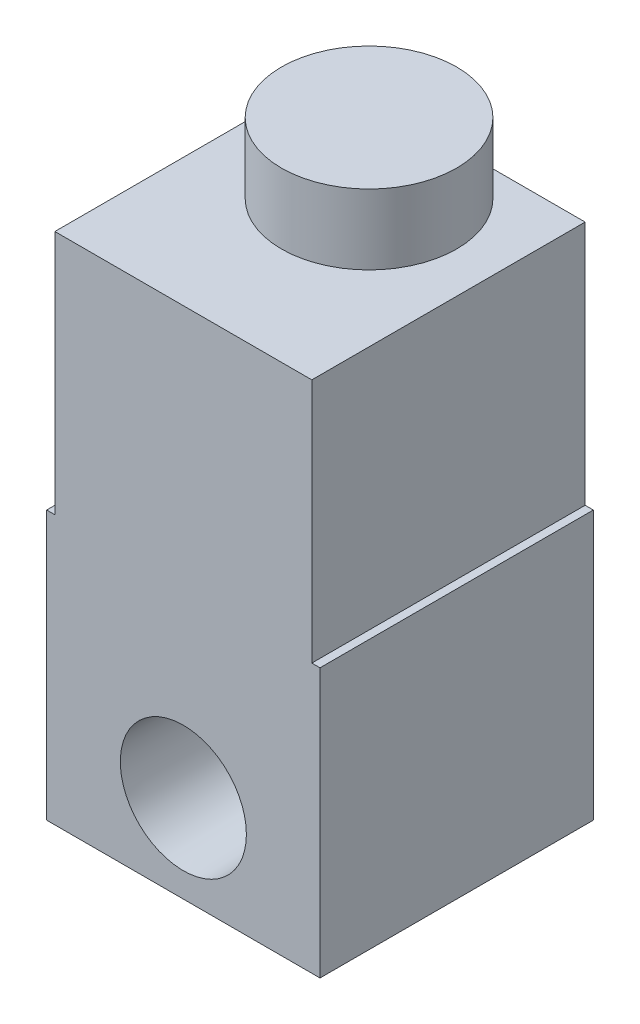
ISO-10303-21;
HEADER;
FILE_DESCRIPTION(('STEP AP214'),'2;1');
FILE_NAME('part.step','',(''),(''),'','','');
FILE_SCHEMA(('AUTOMOTIVE_DESIGN { 1 0 10303 214 1 1 1 1 }'));
ENDSEC;
DATA;
#1=APPLICATION_CONTEXT('core data for automotive mechanical design processes');
#2=APPLICATION_PROTOCOL_DEFINITION('international standard','automotive_design',2000,#1);
#3=PRODUCT_CONTEXT('',#1,'mechanical');
#4=PRODUCT('Part','Part','',(#3));
#5=PRODUCT_RELATED_PRODUCT_CATEGORY('part','',(#4));
#6=PRODUCT_DEFINITION_FORMATION('','',#4);
#7=PRODUCT_DEFINITION_CONTEXT('part definition',#1,'design');
#8=PRODUCT_DEFINITION('design','',#6,#7);
#9=PRODUCT_DEFINITION_SHAPE('','',#8);
#10=(LENGTH_UNIT() NAMED_UNIT(*) SI_UNIT(.MILLI.,.METRE.));
#11=(NAMED_UNIT(*) PLANE_ANGLE_UNIT() SI_UNIT($,.RADIAN.));
#12=(NAMED_UNIT(*) SI_UNIT($,.STERADIAN.) SOLID_ANGLE_UNIT());
#13=UNCERTAINTY_MEASURE_WITH_UNIT(LENGTH_MEASURE(1.E-05),#10,'distance_accuracy_value','');
#14=(GEOMETRIC_REPRESENTATION_CONTEXT(3) GLOBAL_UNCERTAINTY_ASSIGNED_CONTEXT((#13)) GLOBAL_UNIT_ASSIGNED_CONTEXT((#10,
#11,#12)) REPRESENTATION_CONTEXT('',''));
#15=CARTESIAN_POINT('',(0.,0.,0.));
#16=DIRECTION('',(0.,0.,1.));
#17=DIRECTION('',(1.,0.,0.));
#18=AXIS2_PLACEMENT_3D('',#15,#16,#17);
#19=CARTESIAN_POINT('',(0.,0.,29.718));
#20=DIRECTION('',(0.,0.,-1.));
#21=DIRECTION('',(-1.,0.,0.));
#22=AXIS2_PLACEMENT_3D('',#19,#20,#21);
#23=PLANE('',#22);
#24=DIRECTION('',(1.,0.,0.));
#25=VECTOR('',#24,1.);
#26=CARTESIAN_POINT('',(29.718,0.,29.718));
#27=LINE('',#26,#25);
#28=CARTESIAN_POINT('',(0.,0.,29.718));
#29=VERTEX_POINT('',#28);
#30=CARTESIAN_POINT('',(29.718,0.,29.718));
#31=VERTEX_POINT('',#30);
#32=EDGE_CURVE('E174',#29,#31,#27,.T.);
#33=ORIENTED_EDGE('',*,*,#32,.T.);
#34=DIRECTION('',(0.,1.,0.));
#35=VECTOR('',#34,1.);
#36=CARTESIAN_POINT('',(29.718,29.21,29.718));
#37=LINE('',#36,#35);
#38=CARTESIAN_POINT('',(29.718,29.21,29.718));
#39=VERTEX_POINT('',#38);
#40=EDGE_CURVE('E107',#31,#39,#37,.T.);
#41=ORIENTED_EDGE('',*,*,#40,.T.);
#42=DIRECTION('',(-1.,0.,0.));
#43=VECTOR('',#42,1.);
#44=CARTESIAN_POINT('',(28.829,29.21,29.718));
#45=LINE('',#44,#43);
#46=CARTESIAN_POINT('',(28.829,29.21,29.718));
#47=VERTEX_POINT('',#46);
#48=EDGE_CURVE('E195',#39,#47,#45,.T.);
#49=ORIENTED_EDGE('',*,*,#48,.T.);
#50=DIRECTION('',(0.,1.,0.));
#51=VECTOR('',#50,1.);
#52=CARTESIAN_POINT('',(28.829,55.88,29.718));
#53=LINE('',#52,#51);
#54=CARTESIAN_POINT('',(28.829,55.88,29.718));
#55=VERTEX_POINT('',#54);
#56=EDGE_CURVE('E210',#47,#55,#53,.T.);
#57=ORIENTED_EDGE('',*,*,#56,.T.);
#58=DIRECTION('',(-1.,0.,0.));
#59=VECTOR('',#58,1.);
#60=CARTESIAN_POINT('',(0.888999999999998,55.88,29.718));
#61=LINE('',#60,#59);
#62=CARTESIAN_POINT('',(0.888999999999998,55.88,29.718));
#63=VERTEX_POINT('',#62);
#64=EDGE_CURVE('E127',#55,#63,#61,.T.);
#65=ORIENTED_EDGE('',*,*,#64,.T.);
#66=DIRECTION('',(0.,-1.,0.));
#67=VECTOR('',#66,1.);
#68=CARTESIAN_POINT('',(0.888999999999998,29.21,29.718));
#69=LINE('',#68,#67);
#70=CARTESIAN_POINT('',(0.888999999999998,29.21,29.718));
#71=VERTEX_POINT('',#70);
#72=EDGE_CURVE('E121',#63,#71,#69,.T.);
#73=ORIENTED_EDGE('',*,*,#72,.T.);
#74=DIRECTION('',(-1.,0.,0.));
#75=VECTOR('',#74,1.);
#76=CARTESIAN_POINT('',(0.,29.21,29.718));
#77=LINE('',#76,#75);
#78=CARTESIAN_POINT('',(0.,29.21,29.718));
#79=VERTEX_POINT('',#78);
#80=EDGE_CURVE('E125',#71,#79,#77,.T.);
#81=ORIENTED_EDGE('',*,*,#80,.T.);
#82=DIRECTION('',(0.,-1.,0.));
#83=VECTOR('',#82,1.);
#84=CARTESIAN_POINT('',(0.,0.,29.718));
#85=LINE('',#84,#83);
#86=EDGE_CURVE('E63',#79,#29,#85,.T.);
#87=ORIENTED_EDGE('',*,*,#86,.T.);
#88=EDGE_LOOP('',(#33,#41,#49,#57,#65,#73,#81,#87));
#89=FACE_BOUND('',#88,.T.);
#90=CARTESIAN_POINT('',(14.859,9.525,29.718));
#91=DIRECTION('',(0.,0.,1.));
#92=DIRECTION('',(1.,0.,0.));
#93=AXIS2_PLACEMENT_3D('',#90,#91,#92);
#94=CIRCLE('',#93,6.8545837);
#95=CARTESIAN_POINT('',(21.7135837,9.525,29.718));
#96=VERTEX_POINT('',#95);
#97=EDGE_CURVE('E239',#96,#96,#94,.T.);
#98=ORIENTED_EDGE('',*,*,#97,.F.);
#99=EDGE_LOOP('',(#98));
#100=FACE_BOUND('',#99,.T.);
#101=ADVANCED_FACE('F45',(#89,#100),#23,.F.);
#102=CARTESIAN_POINT('',(29.718,0.,29.718));
#103=DIRECTION('',(0.,1.,0.));
#104=DIRECTION('',(-1.,0.,0.));
#105=AXIS2_PLACEMENT_3D('',#102,#103,#104);
#106=PLANE('',#105);
#107=DIRECTION('',(1.,0.,0.));
#108=VECTOR('',#107,1.);
#109=CARTESIAN_POINT('',(29.718,0.,0.));
#110=LINE('',#109,#108);
#111=CARTESIAN_POINT('',(0.,0.,0.));
#112=VERTEX_POINT('',#111);
#113=CARTESIAN_POINT('',(29.718,0.,0.));
#114=VERTEX_POINT('',#113);
#115=EDGE_CURVE('E149',#112,#114,#110,.T.);
#116=ORIENTED_EDGE('',*,*,#115,.T.);
#117=DIRECTION('',(0.,0.,-1.));
#118=VECTOR('',#117,1.);
#119=CARTESIAN_POINT('',(29.718,0.,29.718));
#120=LINE('',#119,#118);
#121=EDGE_CURVE('E11',#31,#114,#120,.T.);
#122=ORIENTED_EDGE('',*,*,#121,.F.);
#123=ORIENTED_EDGE('',*,*,#32,.F.);
#124=DIRECTION('',(0.,0.,-1.));
#125=VECTOR('',#124,1.);
#126=CARTESIAN_POINT('',(0.,0.,29.718));
#127=LINE('',#126,#125);
#128=EDGE_CURVE('E145',#29,#112,#127,.T.);
#129=ORIENTED_EDGE('',*,*,#128,.T.);
#130=EDGE_LOOP('',(#116,#122,#123,#129));
#131=FACE_BOUND('',#130,.T.);
#132=ADVANCED_FACE('F47',(#131),#106,.F.);
#133=CARTESIAN_POINT('',(29.718,29.21,29.718));
#134=DIRECTION('',(-1.,0.,0.));
#135=DIRECTION('',(0.,0.,1.));
#136=AXIS2_PLACEMENT_3D('',#133,#134,#135);
#137=PLANE('',#136);
#138=DIRECTION('',(0.,1.,0.));
#139=VECTOR('',#138,1.);
#140=CARTESIAN_POINT('',(29.718,29.21,0.));
#141=LINE('',#140,#139);
#142=CARTESIAN_POINT('',(29.718,29.21,0.));
#143=VERTEX_POINT('',#142);
#144=EDGE_CURVE('E153',#114,#143,#141,.T.);
#145=ORIENTED_EDGE('',*,*,#144,.T.);
#146=DIRECTION('',(0.,0.,-1.));
#147=VECTOR('',#146,1.);
#148=CARTESIAN_POINT('',(29.718,29.21,29.718));
#149=LINE('',#148,#147);
#150=EDGE_CURVE('E55',#39,#143,#149,.T.);
#151=ORIENTED_EDGE('',*,*,#150,.F.);
#152=ORIENTED_EDGE('',*,*,#40,.F.);
#153=ORIENTED_EDGE('',*,*,#121,.T.);
#154=EDGE_LOOP('',(#145,#151,#152,#153));
#155=FACE_BOUND('',#154,.T.);
#156=ADVANCED_FACE('F278',(#155),#137,.F.);
#157=CARTESIAN_POINT('',(28.829,29.21,29.718));
#158=DIRECTION('',(0.,-1.,0.));
#159=DIRECTION('',(0.,0.,-1.));
#160=AXIS2_PLACEMENT_3D('',#157,#158,#159);
#161=PLANE('',#160);
#162=DIRECTION('',(-1.,0.,0.));
#163=VECTOR('',#162,1.);
#164=CARTESIAN_POINT('',(28.829,29.21,0.));
#165=LINE('',#164,#163);
#166=CARTESIAN_POINT('',(28.829,29.21,0.));
#167=VERTEX_POINT('',#166);
#168=EDGE_CURVE('E157',#143,#167,#165,.T.);
#169=ORIENTED_EDGE('',*,*,#168,.T.);
#170=DIRECTION('',(0.,0.,-1.));
#171=VECTOR('',#170,1.);
#172=CARTESIAN_POINT('',(28.829,29.21,29.718));
#173=LINE('',#172,#171);
#174=EDGE_CURVE('E185',#47,#167,#173,.T.);
#175=ORIENTED_EDGE('',*,*,#174,.F.);
#176=ORIENTED_EDGE('',*,*,#48,.F.);
#177=ORIENTED_EDGE('',*,*,#150,.T.);
#178=EDGE_LOOP('',(#169,#175,#176,#177));
#179=FACE_BOUND('',#178,.T.);
#180=ADVANCED_FACE('F193',(#179),#161,.F.);
#181=CARTESIAN_POINT('',(28.829,55.88,29.718));
#182=DIRECTION('',(-1.,0.,0.));
#183=DIRECTION('',(0.,0.,1.));
#184=AXIS2_PLACEMENT_3D('',#181,#182,#183);
#185=PLANE('',#184);
#186=DIRECTION('',(0.,1.,0.));
#187=VECTOR('',#186,1.);
#188=CARTESIAN_POINT('',(28.829,55.88,0.));
#189=LINE('',#188,#187);
#190=CARTESIAN_POINT('',(28.829,55.88,0.));
#191=VERTEX_POINT('',#190);
#192=EDGE_CURVE('E160',#167,#191,#189,.T.);
#193=ORIENTED_EDGE('',*,*,#192,.T.);
#194=DIRECTION('',(0.,0.,-1.));
#195=VECTOR('',#194,1.);
#196=CARTESIAN_POINT('',(28.829,55.88,29.718));
#197=LINE('',#196,#195);
#198=EDGE_CURVE('E181',#55,#191,#197,.T.);
#199=ORIENTED_EDGE('',*,*,#198,.F.);
#200=ORIENTED_EDGE('',*,*,#56,.F.);
#201=ORIENTED_EDGE('',*,*,#174,.T.);
#202=EDGE_LOOP('',(#193,#199,#200,#201));
#203=FACE_BOUND('',#202,.T.);
#204=ADVANCED_FACE('F204',(#203),#185,.F.);
#205=CARTESIAN_POINT('',(0.888999999999998,55.88,29.718));
#206=DIRECTION('',(0.,-1.,0.));
#207=DIRECTION('',(0.,0.,-1.));
#208=AXIS2_PLACEMENT_3D('',#205,#206,#207);
#209=PLANE('',#208);
#210=DIRECTION('',(-1.,0.,0.));
#211=VECTOR('',#210,1.);
#212=CARTESIAN_POINT('',(0.888999999999998,55.88,0.));
#213=LINE('',#212,#211);
#214=CARTESIAN_POINT('',(14.859,55.88,0.));
#215=VERTEX_POINT('',#214);
#216=EDGE_CURVE('E164',#191,#215,#213,.T.);
#217=ORIENTED_EDGE('',*,*,#216,.T.);
#218=CARTESIAN_POINT('',(14.859,55.88,9.525));
#219=DIRECTION('',(0.,1.,0.));
#220=DIRECTION('',(0.,0.,1.));
#221=AXIS2_PLACEMENT_3D('',#218,#219,#220);
#222=CIRCLE('',#221,9.525);
#223=EDGE_CURVE('E220',#215,#215,#222,.T.);
#224=ORIENTED_EDGE('',*,*,#223,.F.);
#225=CARTESIAN_POINT('',(0.888999999999998,55.88,0.));
#226=VERTEX_POINT('',#225);
#227=EDGE_CURVE('E163',#215,#226,#213,.T.);
#228=ORIENTED_EDGE('',*,*,#227,.T.);
#229=DIRECTION('',(0.,0.,-1.));
#230=VECTOR('',#229,1.);
#231=CARTESIAN_POINT('',(0.888999999999998,55.88,29.718));
#232=LINE('',#231,#230);
#233=EDGE_CURVE('E138',#63,#226,#232,.T.);
#234=ORIENTED_EDGE('',*,*,#233,.F.);
#235=ORIENTED_EDGE('',*,*,#64,.F.);
#236=ORIENTED_EDGE('',*,*,#198,.T.);
#237=EDGE_LOOP('',(#217,#224,#228,#234,#235,#236));
#238=FACE_BOUND('',#237,.T.);
#239=ADVANCED_FACE('F207',(#238),#209,.F.);
#240=CARTESIAN_POINT('',(0.888999999999998,29.21,29.718));
#241=DIRECTION('',(1.,0.,0.));
#242=DIRECTION('',(0.,0.,-1.));
#243=AXIS2_PLACEMENT_3D('',#240,#241,#242);
#244=PLANE('',#243);
#245=DIRECTION('',(0.,-1.,0.));
#246=VECTOR('',#245,1.);
#247=CARTESIAN_POINT('',(0.888999999999998,29.21,0.));
#248=LINE('',#247,#246);
#249=CARTESIAN_POINT('',(0.888999999999998,29.21,0.));
#250=VERTEX_POINT('',#249);
#251=EDGE_CURVE('E136',#226,#250,#248,.T.);
#252=ORIENTED_EDGE('',*,*,#251,.T.);
#253=DIRECTION('',(0.,0.,-1.));
#254=VECTOR('',#253,1.);
#255=CARTESIAN_POINT('',(0.888999999999998,29.21,29.718));
#256=LINE('',#255,#254);
#257=EDGE_CURVE('E133',#71,#250,#256,.T.);
#258=ORIENTED_EDGE('',*,*,#257,.F.);
#259=ORIENTED_EDGE('',*,*,#72,.F.);
#260=ORIENTED_EDGE('',*,*,#233,.T.);
#261=EDGE_LOOP('',(#252,#258,#259,#260));
#262=FACE_BOUND('',#261,.T.);
#263=ADVANCED_FACE('F134',(#262),#244,.F.);
#264=CARTESIAN_POINT('',(0.,29.21,29.718));
#265=DIRECTION('',(0.,-1.,0.));
#266=DIRECTION('',(0.,0.,-1.));
#267=AXIS2_PLACEMENT_3D('',#264,#265,#266);
#268=PLANE('',#267);
#269=DIRECTION('',(-1.,0.,0.));
#270=VECTOR('',#269,1.);
#271=CARTESIAN_POINT('',(0.,29.21,0.));
#272=LINE('',#271,#270);
#273=CARTESIAN_POINT('',(0.,29.21,0.));
#274=VERTEX_POINT('',#273);
#275=EDGE_CURVE('E93',#250,#274,#272,.T.);
#276=ORIENTED_EDGE('',*,*,#275,.T.);
#277=DIRECTION('',(0.,0.,-1.));
#278=VECTOR('',#277,1.);
#279=CARTESIAN_POINT('',(0.,29.21,29.718));
#280=LINE('',#279,#278);
#281=EDGE_CURVE('E139',#79,#274,#280,.T.);
#282=ORIENTED_EDGE('',*,*,#281,.F.);
#283=ORIENTED_EDGE('',*,*,#80,.F.);
#284=ORIENTED_EDGE('',*,*,#257,.T.);
#285=EDGE_LOOP('',(#276,#282,#283,#284));
#286=FACE_BOUND('',#285,.T.);
#287=ADVANCED_FACE('F141',(#286),#268,.F.);
#288=CARTESIAN_POINT('',(0.,0.,29.718));
#289=DIRECTION('',(1.,0.,0.));
#290=DIRECTION('',(0.,0.,-1.));
#291=AXIS2_PLACEMENT_3D('',#288,#289,#290);
#292=PLANE('',#291);
#293=DIRECTION('',(0.,-1.,0.));
#294=VECTOR('',#293,1.);
#295=CARTESIAN_POINT('',(0.,0.,0.));
#296=LINE('',#295,#294);
#297=EDGE_CURVE('E99',#274,#112,#296,.T.);
#298=ORIENTED_EDGE('',*,*,#297,.T.);
#299=ORIENTED_EDGE('',*,*,#128,.F.);
#300=ORIENTED_EDGE('',*,*,#86,.F.);
#301=ORIENTED_EDGE('',*,*,#281,.T.);
#302=EDGE_LOOP('',(#298,#299,#300,#301));
#303=FACE_BOUND('',#302,.T.);
#304=ADVANCED_FACE('F286',(#303),#292,.F.);
#305=CARTESIAN_POINT('',(0.,0.,0.));
#306=DIRECTION('',(0.,0.,-1.));
#307=DIRECTION('',(-1.,0.,0.));
#308=AXIS2_PLACEMENT_3D('',#305,#306,#307);
#309=PLANE('',#308);
#310=CARTESIAN_POINT('',(14.859,9.525,0.));
#311=DIRECTION('',(0.,0.,1.));
#312=DIRECTION('',(1.,0.,0.));
#313=AXIS2_PLACEMENT_3D('',#310,#311,#312);
#314=CIRCLE('',#313,6.1976);
#315=CARTESIAN_POINT('',(21.0566,9.525,0.));
#316=VERTEX_POINT('',#315);
#317=EDGE_CURVE('E243',#316,#316,#314,.T.);
#318=ORIENTED_EDGE('',*,*,#317,.T.);
#319=EDGE_LOOP('',(#318));
#320=FACE_BOUND('',#319,.T.);
#321=ORIENTED_EDGE('',*,*,#115,.F.);
#322=ORIENTED_EDGE('',*,*,#297,.F.);
#323=ORIENTED_EDGE('',*,*,#275,.F.);
#324=ORIENTED_EDGE('',*,*,#251,.F.);
#325=ORIENTED_EDGE('',*,*,#227,.F.);
#326=ORIENTED_EDGE('',*,*,#216,.F.);
#327=ORIENTED_EDGE('',*,*,#192,.F.);
#328=ORIENTED_EDGE('',*,*,#168,.F.);
#329=ORIENTED_EDGE('',*,*,#144,.F.);
#330=EDGE_LOOP('',(#321,#322,#323,#324,#325,#326,#327,#328,#329));
#331=FACE_BOUND('',#330,.T.);
#332=ADVANCED_FACE('F199',(#320,#331),#309,.T.);
#333=CARTESIAN_POINT('',(14.859,63.5,9.525));
#334=DIRECTION('',(0.,-1.,0.));
#335=DIRECTION('',(0.,0.,-1.));
#336=AXIS2_PLACEMENT_3D('',#333,#334,#335);
#337=CYLINDRICAL_SURFACE('',#336,9.525);
#338=CARTESIAN_POINT('',(14.859,63.5,9.525));
#339=DIRECTION('',(0.,1.,0.));
#340=DIRECTION('',(0.,0.,1.));
#341=AXIS2_PLACEMENT_3D('',#338,#339,#340);
#342=CIRCLE('',#341,9.525);
#343=CARTESIAN_POINT('',(14.859,63.5,19.05));
#344=VERTEX_POINT('',#343);
#345=EDGE_CURVE('E154',#344,#344,#342,.T.);
#346=ORIENTED_EDGE('',*,*,#345,.F.);
#347=EDGE_LOOP('',(#346));
#348=FACE_BOUND('',#347,.T.);
#349=ORIENTED_EDGE('',*,*,#223,.T.);
#350=EDGE_LOOP('',(#349));
#351=FACE_BOUND('',#350,.T.);
#352=ADVANCED_FACE('F282',(#348,#351),#337,.T.);
#353=CARTESIAN_POINT('',(14.859,63.5,9.525));
#354=DIRECTION('',(0.,1.,0.));
#355=DIRECTION('',(0.,0.,1.));
#356=AXIS2_PLACEMENT_3D('',#353,#354,#355);
#357=PLANE('',#356);
#358=ORIENTED_EDGE('',*,*,#345,.T.);
#359=EDGE_LOOP('',(#358));
#360=FACE_BOUND('',#359,.T.);
#361=ADVANCED_FACE('F253',(#360),#357,.T.);
#362=CARTESIAN_POINT('',(14.859,9.525,0.63499999999999));
#363=DIRECTION('',(0.,0.,-1.));
#364=DIRECTION('',(-1.,0.,0.));
#365=AXIS2_PLACEMENT_3D('',#362,#363,#364);
#366=CONICAL_SURFACE('',#365,5.5626,0.785398163397454);
#367=ORIENTED_EDGE('',*,*,#317,.F.);
#368=EDGE_LOOP('',(#367));
#369=FACE_BOUND('',#368,.T.);
#370=CARTESIAN_POINT('',(14.859,9.525,0.63499999999999));
#371=DIRECTION('',(0.,0.,1.));
#372=DIRECTION('',(1.,0.,0.));
#373=AXIS2_PLACEMENT_3D('',#370,#371,#372);
#374=CIRCLE('',#373,5.5626);
#375=CARTESIAN_POINT('',(20.4216,9.525,0.63499999999999));
#376=VERTEX_POINT('',#375);
#377=EDGE_CURVE('E224',#376,#376,#374,.T.);
#378=ORIENTED_EDGE('',*,*,#377,.T.);
#379=EDGE_LOOP('',(#378));
#380=FACE_BOUND('',#379,.T.);
#381=ADVANCED_FACE('F249',(#369,#380),#366,.F.);
#382=CARTESIAN_POINT('',(14.859,9.525,29.718));
#383=DIRECTION('',(0.,0.,1.));
#384=DIRECTION('',(1.,0.,0.));
#385=AXIS2_PLACEMENT_3D('',#382,#383,#384);
#386=CYLINDRICAL_SURFACE('',#385,5.5626);
#387=ORIENTED_EDGE('',*,*,#377,.F.);
#388=EDGE_LOOP('',(#387));
#389=FACE_BOUND('',#388,.T.);
#390=CARTESIAN_POINT('',(14.859,9.525,19.812));
#391=DIRECTION('',(0.,0.,1.));
#392=DIRECTION('',(1.,0.,0.));
#393=AXIS2_PLACEMENT_3D('',#390,#391,#392);
#394=CIRCLE('',#393,5.5626);
#395=CARTESIAN_POINT('',(20.4216,9.525,19.812));
#396=VERTEX_POINT('',#395);
#397=EDGE_CURVE('E231',#396,#396,#394,.T.);
#398=ORIENTED_EDGE('',*,*,#397,.T.);
#399=EDGE_LOOP('',(#398));
#400=FACE_BOUND('',#399,.T.);
#401=ADVANCED_FACE('F252',(#389,#400),#386,.F.);
#402=CARTESIAN_POINT('',(20.4216,9.525,19.812));
#403=DIRECTION('',(0.,0.,-1.));
#404=DIRECTION('',(-1.,0.,0.));
#405=AXIS2_PLACEMENT_3D('',#402,#403,#404);
#406=PLANE('',#405);
#407=ORIENTED_EDGE('',*,*,#397,.F.);
#408=EDGE_LOOP('',(#407));
#409=FACE_BOUND('',#408,.T.);
#410=CARTESIAN_POINT('',(14.859,9.525,19.812));
#411=DIRECTION('',(0.,0.,1.));
#412=DIRECTION('',(1.,0.,0.));
#413=AXIS2_PLACEMENT_3D('',#410,#411,#412);
#414=CIRCLE('',#413,6.55798479417672);
#415=CARTESIAN_POINT('',(21.4169847941767,9.525,19.812));
#416=VERTEX_POINT('',#415);
#417=EDGE_CURVE('E235',#416,#416,#414,.T.);
#418=ORIENTED_EDGE('',*,*,#417,.T.);
#419=EDGE_LOOP('',(#418));
#420=FACE_BOUND('',#419,.T.);
#421=ADVANCED_FACE('F259',(#409,#420),#406,.F.);
#422=CARTESIAN_POINT('',(14.859,9.525,29.718));
#423=DIRECTION('',(0.,0.,1.));
#424=DIRECTION('',(1.,0.,0.));
#425=AXIS2_PLACEMENT_3D('',#422,#423,#424);
#426=CONICAL_SURFACE('',#425,6.8545837,0.0299323966717025);
#427=ORIENTED_EDGE('',*,*,#417,.F.);
#428=EDGE_LOOP('',(#427));
#429=FACE_BOUND('',#428,.T.);
#430=ORIENTED_EDGE('',*,*,#97,.T.);
#431=EDGE_LOOP('',(#430));
#432=FACE_BOUND('',#431,.T.);
#433=ADVANCED_FACE('F265',(#429,#432),#426,.F.);
#434=CLOSED_SHELL('',(#101,#132,#156,#180,#204,#239,#263,#287,#304,#332,#352,#361,#381,#401,
#421,#433));
#435=MANIFOLD_SOLID_BREP('B2',#434);
#436=ADVANCED_BREP_SHAPE_REPRESENTATION('',(#18,#435),#14);
#437=SHAPE_DEFINITION_REPRESENTATION(#9,#436);
ENDSEC;
END-ISO-10303-21;
